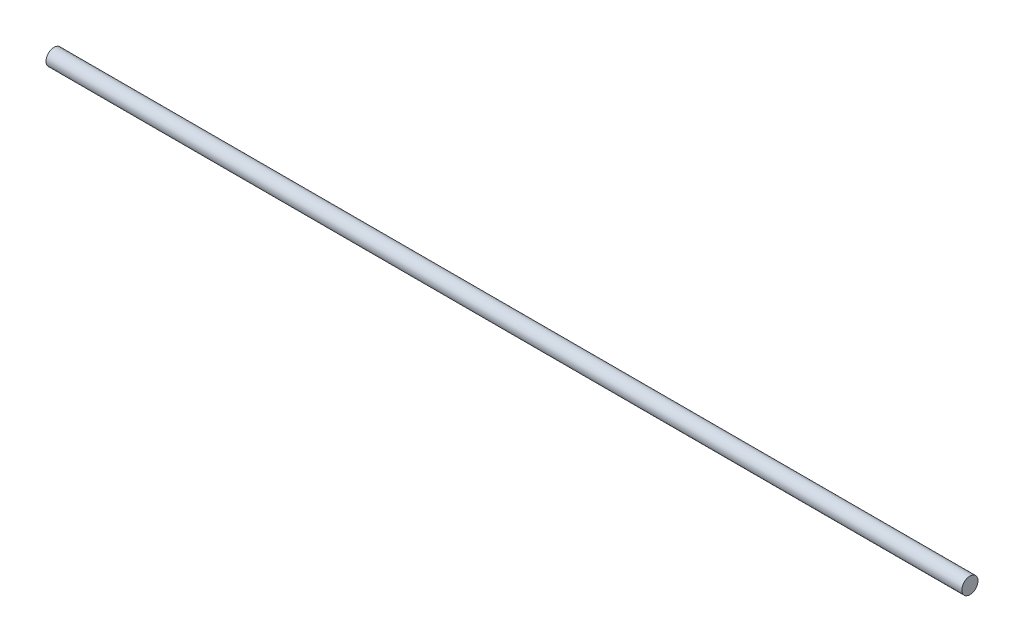
ISO-10303-21;
HEADER;
FILE_DESCRIPTION(('STEP AP214'),'2;1');
FILE_NAME('part.step','',(''),(''),'','','');
FILE_SCHEMA(('AUTOMOTIVE_DESIGN { 1 0 10303 214 1 1 1 1 }'));
ENDSEC;
DATA;
#1=APPLICATION_CONTEXT('core data for automotive mechanical design processes');
#2=APPLICATION_PROTOCOL_DEFINITION('international standard','automotive_design',2000,#1);
#3=PRODUCT_CONTEXT('',#1,'mechanical');
#4=PRODUCT('Part','Part','',(#3));
#5=PRODUCT_RELATED_PRODUCT_CATEGORY('part','',(#4));
#6=PRODUCT_DEFINITION_FORMATION('','',#4);
#7=PRODUCT_DEFINITION_CONTEXT('part definition',#1,'design');
#8=PRODUCT_DEFINITION('design','',#6,#7);
#9=PRODUCT_DEFINITION_SHAPE('','',#8);
#10=(LENGTH_UNIT() NAMED_UNIT(*) SI_UNIT(.MILLI.,.METRE.));
#11=(NAMED_UNIT(*) PLANE_ANGLE_UNIT() SI_UNIT($,.RADIAN.));
#12=(NAMED_UNIT(*) SI_UNIT($,.STERADIAN.) SOLID_ANGLE_UNIT());
#13=UNCERTAINTY_MEASURE_WITH_UNIT(LENGTH_MEASURE(1.E-05),#10,'distance_accuracy_value','');
#14=(GEOMETRIC_REPRESENTATION_CONTEXT(3) GLOBAL_UNCERTAINTY_ASSIGNED_CONTEXT((#13)) GLOBAL_UNIT_ASSIGNED_CONTEXT((#10,
#11,#12)) REPRESENTATION_CONTEXT('',''));
#15=CARTESIAN_POINT('',(0.,0.,0.));
#16=DIRECTION('',(0.,0.,1.));
#17=DIRECTION('',(1.,0.,0.));
#18=AXIS2_PLACEMENT_3D('',#15,#16,#17);
#19=CARTESIAN_POINT('',(2159.,0.,0.));
#20=DIRECTION('',(-1.,0.,0.));
#21=DIRECTION('',(0.,0.,1.));
#22=AXIS2_PLACEMENT_3D('',#19,#20,#21);
#23=CYLINDRICAL_SURFACE('',#22,19.05);
#24=CARTESIAN_POINT('',(2159.,0.,0.));
#25=DIRECTION('',(1.,0.,0.));
#26=DIRECTION('',(0.,0.,-1.));
#27=AXIS2_PLACEMENT_3D('',#24,#25,#26);
#28=CIRCLE('',#27,19.05);
#29=CARTESIAN_POINT('',(2159.,0.,-19.05));
#30=VERTEX_POINT('',#29);
#31=EDGE_CURVE('E10',#30,#30,#28,.T.);
#32=ORIENTED_EDGE('',*,*,#31,.F.);
#33=EDGE_LOOP('',(#32));
#34=FACE_BOUND('',#33,.T.);
#35=CARTESIAN_POINT('',(0.,0.,0.));
#36=DIRECTION('',(1.,0.,0.));
#37=DIRECTION('',(0.,0.,-1.));
#38=AXIS2_PLACEMENT_3D('',#35,#36,#37);
#39=CIRCLE('',#38,19.05);
#40=CARTESIAN_POINT('',(0.,0.,-19.05));
#41=VERTEX_POINT('',#40);
#42=EDGE_CURVE('E40',#41,#41,#39,.T.);
#43=ORIENTED_EDGE('',*,*,#42,.T.);
#44=EDGE_LOOP('',(#43));
#45=FACE_BOUND('',#44,.T.);
#46=ADVANCED_FACE('F37',(#34,#45),#23,.T.);
#47=CARTESIAN_POINT('',(2159.,0.,0.));
#48=DIRECTION('',(1.,0.,0.));
#49=DIRECTION('',(0.,0.,-1.));
#50=AXIS2_PLACEMENT_3D('',#47,#48,#49);
#51=PLANE('',#50);
#52=ORIENTED_EDGE('',*,*,#31,.T.);
#53=EDGE_LOOP('',(#52));
#54=FACE_BOUND('',#53,.T.);
#55=ADVANCED_FACE('F54',(#54),#51,.T.);
#56=CARTESIAN_POINT('',(0.,0.,0.));
#57=DIRECTION('',(1.,0.,0.));
#58=DIRECTION('',(0.,0.,-1.));
#59=AXIS2_PLACEMENT_3D('',#56,#57,#58);
#60=PLANE('',#59);
#61=ORIENTED_EDGE('',*,*,#42,.F.);
#62=EDGE_LOOP('',(#61));
#63=FACE_BOUND('',#62,.T.);
#64=ADVANCED_FACE('F52',(#63),#60,.F.);
#65=CLOSED_SHELL('',(#46,#55,#64));
#66=MANIFOLD_SOLID_BREP('B2',#65);
#67=ADVANCED_BREP_SHAPE_REPRESENTATION('',(#18,#66),#14);
#68=SHAPE_DEFINITION_REPRESENTATION(#9,#67);
ENDSEC;
END-ISO-10303-21;
